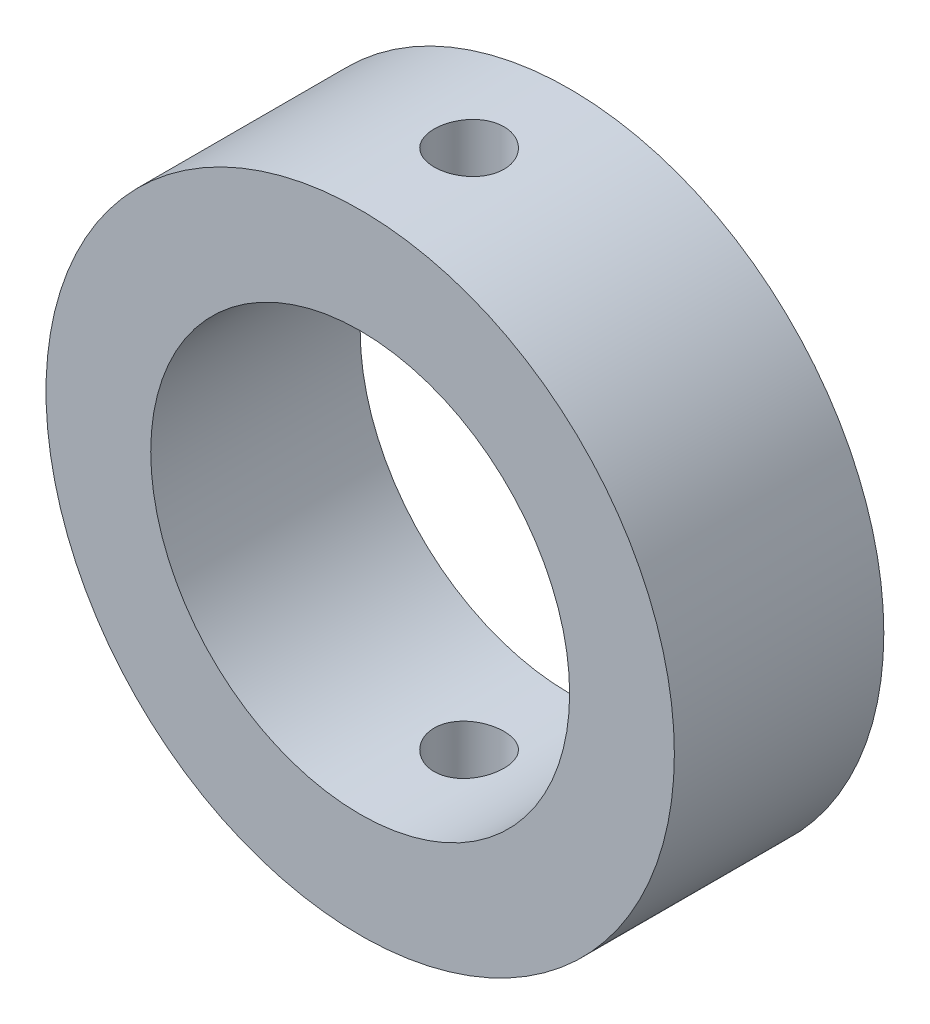
ISO-10303-21;
HEADER;
FILE_DESCRIPTION(('STEP AP214'),'2;1');
FILE_NAME('part.step','',(''),(''),'','','');
FILE_SCHEMA(('AUTOMOTIVE_DESIGN { 1 0 10303 214 1 1 1 1 }'));
ENDSEC;
DATA;
#1=APPLICATION_CONTEXT('core data for automotive mechanical design processes');
#2=APPLICATION_PROTOCOL_DEFINITION('international standard','automotive_design',2000,#1);
#3=PRODUCT_CONTEXT('',#1,'mechanical');
#4=PRODUCT('Part','Part','',(#3));
#5=PRODUCT_RELATED_PRODUCT_CATEGORY('part','',(#4));
#6=PRODUCT_DEFINITION_FORMATION('','',#4);
#7=PRODUCT_DEFINITION_CONTEXT('part definition',#1,'design');
#8=PRODUCT_DEFINITION('design','',#6,#7);
#9=PRODUCT_DEFINITION_SHAPE('','',#8);
#10=(LENGTH_UNIT() NAMED_UNIT(*) SI_UNIT(.MILLI.,.METRE.));
#11=(NAMED_UNIT(*) PLANE_ANGLE_UNIT() SI_UNIT($,.RADIAN.));
#12=(NAMED_UNIT(*) SI_UNIT($,.STERADIAN.) SOLID_ANGLE_UNIT());
#13=UNCERTAINTY_MEASURE_WITH_UNIT(LENGTH_MEASURE(1.E-05),#10,'distance_accuracy_value','');
#14=(GEOMETRIC_REPRESENTATION_CONTEXT(3) GLOBAL_UNCERTAINTY_ASSIGNED_CONTEXT((#13)) GLOBAL_UNIT_ASSIGNED_CONTEXT((#10,
#11,#12)) REPRESENTATION_CONTEXT('',''));
#15=CARTESIAN_POINT('',(0.,0.,0.));
#16=DIRECTION('',(0.,0.,1.));
#17=DIRECTION('',(1.,0.,0.));
#18=AXIS2_PLACEMENT_3D('',#15,#16,#17);
#19=CARTESIAN_POINT('',(0.,0.,15.));
#20=DIRECTION('',(0.,0.,1.));
#21=DIRECTION('',(1.,0.,0.));
#22=AXIS2_PLACEMENT_3D('',#19,#20,#21);
#23=PLANE('',#22);
#24=CARTESIAN_POINT('',(0.,0.,15.));
#25=DIRECTION('',(0.,0.,1.));
#26=DIRECTION('',(1.,0.,0.));
#27=AXIS2_PLACEMENT_3D('',#24,#25,#26);
#28=CIRCLE('',#27,22.5);
#29=CARTESIAN_POINT('',(22.5,0.,15.));
#30=VERTEX_POINT('',#29);
#31=EDGE_CURVE('E10',#30,#30,#28,.T.);
#32=ORIENTED_EDGE('',*,*,#31,.T.);
#33=EDGE_LOOP('',(#32));
#34=FACE_BOUND('',#33,.T.);
#35=CARTESIAN_POINT('',(0.,0.,15.));
#36=DIRECTION('',(0.,0.,1.));
#37=DIRECTION('',(1.,0.,0.));
#38=AXIS2_PLACEMENT_3D('',#35,#36,#37);
#39=CIRCLE('',#38,15.);
#40=CARTESIAN_POINT('',(15.,0.,15.));
#41=VERTEX_POINT('',#40);
#42=EDGE_CURVE('E62',#41,#41,#39,.T.);
#43=ORIENTED_EDGE('',*,*,#42,.F.);
#44=EDGE_LOOP('',(#43));
#45=FACE_BOUND('',#44,.T.);
#46=ADVANCED_FACE('F41',(#34,#45),#23,.T.);
#47=CARTESIAN_POINT('',(0.,0.,0.));
#48=DIRECTION('',(0.,0.,1.));
#49=DIRECTION('',(1.,0.,0.));
#50=AXIS2_PLACEMENT_3D('',#47,#48,#49);
#51=PLANE('',#50);
#52=CARTESIAN_POINT('',(0.,0.,0.));
#53=DIRECTION('',(0.,0.,1.));
#54=DIRECTION('',(1.,0.,0.));
#55=AXIS2_PLACEMENT_3D('',#52,#53,#54);
#56=CIRCLE('',#55,22.5);
#57=CARTESIAN_POINT('',(22.5,0.,0.));
#58=VERTEX_POINT('',#57);
#59=EDGE_CURVE('E56',#58,#58,#56,.T.);
#60=ORIENTED_EDGE('',*,*,#59,.F.);
#61=EDGE_LOOP('',(#60));
#62=FACE_BOUND('',#61,.T.);
#63=CARTESIAN_POINT('',(0.,0.,0.));
#64=DIRECTION('',(0.,0.,1.));
#65=DIRECTION('',(1.,0.,0.));
#66=AXIS2_PLACEMENT_3D('',#63,#64,#65);
#67=CIRCLE('',#66,15.);
#68=CARTESIAN_POINT('',(15.,0.,0.));
#69=VERTEX_POINT('',#68);
#70=EDGE_CURVE('E65',#69,#69,#67,.T.);
#71=ORIENTED_EDGE('',*,*,#70,.T.);
#72=EDGE_LOOP('',(#71));
#73=FACE_BOUND('',#72,.T.);
#74=ADVANCED_FACE('F106',(#62,#73),#51,.F.);
#75=CARTESIAN_POINT('',(0.,0.,15.));
#76=DIRECTION('',(0.,0.,-1.));
#77=DIRECTION('',(-1.,0.,0.));
#78=AXIS2_PLACEMENT_3D('',#75,#76,#77);
#79=CYLINDRICAL_SURFACE('',#78,22.5);
#80=CARTESIAN_POINT('',(0.,-22.5,9.7015139556576));
#81=CARTESIAN_POINT('',(0.139963290436898,-22.4999982319295,9.70150793962353));
#82=CARTESIAN_POINT('',(0.280017003711887,-22.498680176381,9.6897205242765));
#83=CARTESIAN_POINT('',(0.556235592308377,-22.4935489494524,9.64287954512737));
#84=CARTESIAN_POINT('',(0.692396111397232,-22.4897330890894,9.60780090684405));
#85=CARTESIAN_POINT('',(0.956788848837863,-22.4800366342404,9.51541651167991));
#86=CARTESIAN_POINT('',(1.08502602592203,-22.4741573468395,9.45812482333298));
#87=CARTESIAN_POINT('',(1.33003816262482,-22.4609899763586,9.32296943790942));
#88=CARTESIAN_POINT('',(1.44681526466862,-22.4537021573586,9.24510959607115));
#89=CARTESIAN_POINT('',(1.66613219683783,-22.438497147732,9.07066139299739));
#90=CARTESIAN_POINT('',(1.76861447442762,-22.4305776039205,8.97400087458663));
#91=CARTESIAN_POINT('',(1.95593754637563,-22.4150209790671,8.76484961061198));
#92=CARTESIAN_POINT('',(2.04077749124032,-22.4073839116411,8.65235810320943));
#93=CARTESIAN_POINT('',(2.19061627270288,-22.3932333493671,8.41437154536982));
#94=CARTESIAN_POINT('',(2.25556219427924,-22.3867228707193,8.28884298434529));
#95=CARTESIAN_POINT('',(2.36343147250995,-22.3755927254414,8.02857712979876));
#96=CARTESIAN_POINT('',(2.4063554937747,-22.37097300175,7.8938401143226));
#97=CARTESIAN_POINT('',(2.46878993115805,-22.3641693028941,7.61957395832722));
#98=CARTESIAN_POINT('',(2.48839662302771,-22.3619753146837,7.48006698681893));
#99=CARTESIAN_POINT('',(2.50393757504382,-22.3602406332654,7.19972662837));
#100=CARTESIAN_POINT('',(2.49987259455604,-22.3606998549449,7.05889328412288));
#101=CARTESIAN_POINT('',(2.46826480534876,-22.3642105512675,6.78056461194312));
#102=CARTESIAN_POINT('',(2.44082750216216,-22.3672503765387,6.64305713481436));
#103=CARTESIAN_POINT('',(2.36341826447112,-22.3755615896676,6.37461067392166));
#104=CARTESIAN_POINT('',(2.3134459616269,-22.3808330140012,6.24367179756189));
#105=CARTESIAN_POINT('',(2.19227007599314,-22.3930268031299,5.99174842670372));
#106=CARTESIAN_POINT('',(2.1210200860185,-22.3999527698502,5.87078643563783));
#107=CARTESIAN_POINT('',(1.95934463329594,-22.4146723403989,5.64249689224402));
#108=CARTESIAN_POINT('',(1.86891847720993,-22.4224659755942,5.53516983312841));
#109=CARTESIAN_POINT('',(1.67087018617446,-22.4380946122411,5.33658397527184));
#110=CARTESIAN_POINT('',(1.56315700708533,-22.4459296076163,5.24541594912667));
#111=CARTESIAN_POINT('',(1.33390727495122,-22.4607182137728,5.08244097856718));
#112=CARTESIAN_POINT('',(1.2123707003463,-22.4676718231792,5.0106340643504));
#113=CARTESIAN_POINT('',(0.958858294419382,-22.479917262824,4.88842174970165));
#114=CARTESIAN_POINT('',(0.826880006002132,-22.4852087004631,4.83802140443878));
#115=CARTESIAN_POINT('',(0.556262194549203,-22.4935298062661,4.76012173685552));
#116=CARTESIAN_POINT('',(0.417622917822387,-22.4965595579937,4.73262156842469));
#117=CARTESIAN_POINT('',(0.138404164867838,-22.5000051383195,4.70141907851069));
#118=CARTESIAN_POINT('',(-0.00216116111361473,-22.5004347150112,4.69759158841234));
#119=CARTESIAN_POINT('',(-0.28193123585895,-22.4986685150537,4.71351369629893));
#120=CARTESIAN_POINT('',(-0.421136007364149,-22.4964727823619,4.73326289952375));
#121=CARTESIAN_POINT('',(-0.693868824279163,-22.4897113666314,4.79567388122741));
#122=CARTESIAN_POINT('',(-0.827410548202294,-22.4851517930728,4.83827660330445));
#123=CARTESIAN_POINT('',(-1.08545283765862,-22.4741737542704,4.94512430281774));
#124=CARTESIAN_POINT('',(-1.20995315599037,-22.4677552382252,5.00936987172139));
#125=CARTESIAN_POINT('',(-1.44694158139682,-22.4537419625284,5.15798681949632));
#126=CARTESIAN_POINT('',(-1.55937816423878,-22.4461424725451,5.24243990683237));
#127=CARTESIAN_POINT('',(-1.76852479350274,-22.4306339481796,5.42895807857556));
#128=CARTESIAN_POINT('',(-1.86523435019447,-22.4227249041675,5.53102371122303));
#129=CARTESIAN_POINT('',(-2.0406202804102,-22.407446855045,5.75041806699017));
#130=CARTESIAN_POINT('',(-2.11921415672401,-22.4000804205337,5.86781294375545));
#131=CARTESIAN_POINT('',(-2.2555694500626,-22.3867621609139,6.11420931002314));
#132=CARTESIAN_POINT('',(-2.31333120875093,-22.3808103126056,6.24321060912749));
#133=CARTESIAN_POINT('',(-2.40624640126429,-22.3710118528331,6.50888202905337));
#134=CARTESIAN_POINT('',(-2.4414478435141,-22.3671607735444,6.64553518784207));
#135=CARTESIAN_POINT('',(-2.48839847208497,-22.361986494682,6.92285789033464));
#136=CARTESIAN_POINT('',(-2.50014850400818,-22.3606632039622,7.06352728903691));
#137=CARTESIAN_POINT('',(-2.49984946677098,-22.3606965730832,7.34406914948892));
#138=CARTESIAN_POINT('',(-2.48792998803822,-22.3620386401109,7.48394176900879));
#139=CARTESIAN_POINT('',(-2.440903126006,-22.3672202869634,7.75968362856461));
#140=CARTESIAN_POINT('',(-2.40579572545892,-22.3710598686459,7.89555286562268));
#141=CARTESIAN_POINT('',(-2.31342739078205,-22.3807996813889,8.15942334379412));
#142=CARTESIAN_POINT('',(-2.25617129922743,-22.3866994619816,8.28742629770188));
#143=CARTESIAN_POINT('',(-2.12114385984066,-22.3998957650258,8.53202707246773));
#144=CARTESIAN_POINT('',(-2.04337247029699,-22.4071922903172,8.6486248701363));
#145=CARTESIAN_POINT('',(-1.86903744067134,-22.4224078492528,8.86776926331564));
#146=CARTESIAN_POINT('',(-1.77237713625398,-22.4303299544675,8.97023875000251));
#147=CARTESIAN_POINT('',(-1.56320524060516,-22.4458763267716,9.1575562959211));
#148=CARTESIAN_POINT('',(-1.45068988450814,-22.45350052257,9.24240015798156));
#149=CARTESIAN_POINT('',(-1.21261810846859,-22.4676169012086,9.39226936859527));
#150=CARTESIAN_POINT('',(-1.08702305802012,-22.4741055698385,9.45723364282128));
#151=CARTESIAN_POINT('',(-0.82671061895154,-22.4851829429196,9.56506082121364));
#152=CARTESIAN_POINT('',(-0.692003549930552,-22.4897737561695,9.60794826907533));
#153=CARTESIAN_POINT('',(-0.463800299140749,-22.4954040690738,9.65988790748981));
#154=CARTESIAN_POINT('',(-0.371755168576704,-22.4971193575046,9.67547589120662));
#155=CARTESIAN_POINT('',(-0.186486737378385,-22.499417908987,9.69629089173759));
#156=CARTESIAN_POINT('',(-0.0932634430968842,-22.50000117814,9.70151796439482));
#157=CARTESIAN_POINT('',(0.,-22.5,9.7015139556576));
#158=B_SPLINE_CURVE_WITH_KNOTS('',3,(#80,#81,#82,#83,#84,#85,#86,#87,#88,#89,#90,#91,#92,#93,
#94,#95,#96,#97,#98,#99,#100,#101,#102,#103,#104,#105,#106,#107,#108,#109,#110,#111,#112,#113,
#114,#115,#116,#117,#118,#119,#120,#121,#122,#123,#124,#125,#126,#127,#128,#129,#130,#131,#132,
#133,#134,#135,#136,#137,#138,#139,#140,#141,#142,#143,#144,#145,#146,#147,#148,#149,#150,#151,
#152,#153,#154,#155,#156,#157),.UNSPECIFIED.,.T.,.F.,(4,2,2,2,2,2,2,2,2,2,2,2,2,2,2,2,2,2,2,2,2,
2,2,2,2,2,2,2,2,2,2,2,2,2,2,2,2,2,4),(0.,0.419549267838508,0.839550941048734,1.25928704150093,
1.67894452352149,2.10024562230456,2.5215670024037,2.94399949132785,3.36641923069172,
3.78708870275308,4.2077446801939,4.62651176678918,5.0452856984773,5.46497974166264,
5.88468896199524,6.30668590666613,6.728683509522,7.1507807119326,7.57286231810132,
7.99271025838008,8.41255116896649,8.83131234699257,9.25008497007836,9.67058038609554,
10.0910888935848,10.5134761069732,10.9358563925552,11.3573348406517,11.7787980909618,
12.1979601942483,12.6171226093159,13.0361934307407,13.4552651042228,13.8765403683299,
14.2979158355662,14.7205731535823,15.1427595660994,15.4223244437306,15.7018878145635),.UNSPECIFIED.);
#159=CARTESIAN_POINT('',(0.,-22.5,9.7015139556576));
#160=VERTEX_POINT('',#159);
#161=EDGE_CURVE('E92',#160,#160,#158,.T.);
#162=ORIENTED_EDGE('',*,*,#161,.T.);
#163=EDGE_LOOP('',(#162));
#164=FACE_BOUND('',#163,.T.);
#165=CARTESIAN_POINT('',(0.,22.5,9.7015139556576));
#166=CARTESIAN_POINT('',(-0.139963290436898,22.4999982319295,9.70150793962353));
#167=CARTESIAN_POINT('',(-0.280017003711887,22.498680176381,9.6897205242765));
#168=CARTESIAN_POINT('',(-0.556235592308377,22.4935489494524,9.64287954512737));
#169=CARTESIAN_POINT('',(-0.692396111397232,22.4897330890894,9.60780090684405));
#170=CARTESIAN_POINT('',(-0.956788848837863,22.4800366342404,9.51541651167991));
#171=CARTESIAN_POINT('',(-1.08502602592203,22.4741573468395,9.45812482333298));
#172=CARTESIAN_POINT('',(-1.33003816262482,22.4609899763586,9.32296943790942));
#173=CARTESIAN_POINT('',(-1.44681526466862,22.4537021573586,9.24510959607115));
#174=CARTESIAN_POINT('',(-1.66613219683783,22.438497147732,9.07066139299739));
#175=CARTESIAN_POINT('',(-1.76861447442762,22.4305776039205,8.97400087458663));
#176=CARTESIAN_POINT('',(-1.95593754637563,22.4150209790671,8.76484961061198));
#177=CARTESIAN_POINT('',(-2.04077749124032,22.4073839116411,8.65235810320943));
#178=CARTESIAN_POINT('',(-2.19061627270288,22.3932333493671,8.41437154536982));
#179=CARTESIAN_POINT('',(-2.25556219427924,22.3867228707193,8.28884298434529));
#180=CARTESIAN_POINT('',(-2.36343147250995,22.3755927254414,8.02857712979876));
#181=CARTESIAN_POINT('',(-2.4063554937747,22.37097300175,7.8938401143226));
#182=CARTESIAN_POINT('',(-2.46878993115805,22.3641693028941,7.61957395832722));
#183=CARTESIAN_POINT('',(-2.48839662302771,22.3619753146837,7.48006698681893));
#184=CARTESIAN_POINT('',(-2.50393757504382,22.3602406332654,7.19972662837));
#185=CARTESIAN_POINT('',(-2.49987259455604,22.3606998549449,7.05889328412288));
#186=CARTESIAN_POINT('',(-2.46826480534876,22.3642105512675,6.78056461194312));
#187=CARTESIAN_POINT('',(-2.44082750216216,22.3672503765387,6.64305713481436));
#188=CARTESIAN_POINT('',(-2.36341826447112,22.3755615896676,6.37461067392166));
#189=CARTESIAN_POINT('',(-2.3134459616269,22.3808330140012,6.24367179756189));
#190=CARTESIAN_POINT('',(-2.19227007599314,22.3930268031299,5.99174842670372));
#191=CARTESIAN_POINT('',(-2.1210200860185,22.3999527698502,5.87078643563783));
#192=CARTESIAN_POINT('',(-1.95934463329594,22.4146723403989,5.64249689224402));
#193=CARTESIAN_POINT('',(-1.86891847720993,22.4224659755942,5.53516983312841));
#194=CARTESIAN_POINT('',(-1.67087018617446,22.4380946122411,5.33658397527184));
#195=CARTESIAN_POINT('',(-1.56315700708533,22.4459296076163,5.24541594912667));
#196=CARTESIAN_POINT('',(-1.33390727495122,22.4607182137728,5.08244097856718));
#197=CARTESIAN_POINT('',(-1.2123707003463,22.4676718231792,5.0106340643504));
#198=CARTESIAN_POINT('',(-0.958858294419382,22.479917262824,4.88842174970165));
#199=CARTESIAN_POINT('',(-0.826880006002132,22.4852087004631,4.83802140443878));
#200=CARTESIAN_POINT('',(-0.556262194549203,22.4935298062661,4.76012173685552));
#201=CARTESIAN_POINT('',(-0.417622917822387,22.4965595579937,4.73262156842469));
#202=CARTESIAN_POINT('',(-0.138404164867838,22.5000051383195,4.70141907851069));
#203=CARTESIAN_POINT('',(0.00216116111361473,22.5004347150112,4.69759158841234));
#204=CARTESIAN_POINT('',(0.28193123585895,22.4986685150537,4.71351369629893));
#205=CARTESIAN_POINT('',(0.421136007364149,22.4964727823619,4.73326289952375));
#206=CARTESIAN_POINT('',(0.693868824279163,22.4897113666314,4.79567388122741));
#207=CARTESIAN_POINT('',(0.827410548202294,22.4851517930728,4.83827660330445));
#208=CARTESIAN_POINT('',(1.08545283765862,22.4741737542704,4.94512430281774));
#209=CARTESIAN_POINT('',(1.20995315599037,22.4677552382252,5.00936987172139));
#210=CARTESIAN_POINT('',(1.44694158139682,22.4537419625284,5.15798681949632));
#211=CARTESIAN_POINT('',(1.55937816423878,22.4461424725451,5.24243990683237));
#212=CARTESIAN_POINT('',(1.76852479350274,22.4306339481796,5.42895807857556));
#213=CARTESIAN_POINT('',(1.86523435019447,22.4227249041675,5.53102371122303));
#214=CARTESIAN_POINT('',(2.0406202804102,22.407446855045,5.75041806699017));
#215=CARTESIAN_POINT('',(2.11921415672401,22.4000804205337,5.86781294375545));
#216=CARTESIAN_POINT('',(2.2555694500626,22.3867621609139,6.11420931002314));
#217=CARTESIAN_POINT('',(2.31333120875093,22.3808103126056,6.24321060912749));
#218=CARTESIAN_POINT('',(2.40624640126429,22.3710118528331,6.50888202905337));
#219=CARTESIAN_POINT('',(2.4414478435141,22.3671607735444,6.64553518784207));
#220=CARTESIAN_POINT('',(2.48839847208497,22.361986494682,6.92285789033464));
#221=CARTESIAN_POINT('',(2.50014850400818,22.3606632039622,7.06352728903691));
#222=CARTESIAN_POINT('',(2.49984946677098,22.3606965730832,7.34406914948892));
#223=CARTESIAN_POINT('',(2.48792998803822,22.3620386401109,7.48394176900879));
#224=CARTESIAN_POINT('',(2.440903126006,22.3672202869634,7.75968362856461));
#225=CARTESIAN_POINT('',(2.40579572545892,22.3710598686459,7.89555286562268));
#226=CARTESIAN_POINT('',(2.31342739078205,22.3807996813889,8.15942334379412));
#227=CARTESIAN_POINT('',(2.25617129922743,22.3866994619816,8.28742629770188));
#228=CARTESIAN_POINT('',(2.12114385984066,22.3998957650258,8.53202707246773));
#229=CARTESIAN_POINT('',(2.04337247029699,22.4071922903172,8.6486248701363));
#230=CARTESIAN_POINT('',(1.86903744067134,22.4224078492528,8.86776926331564));
#231=CARTESIAN_POINT('',(1.77237713625398,22.4303299544675,8.97023875000251));
#232=CARTESIAN_POINT('',(1.56320524060516,22.4458763267716,9.1575562959211));
#233=CARTESIAN_POINT('',(1.45068988450814,22.45350052257,9.24240015798156));
#234=CARTESIAN_POINT('',(1.21261810846859,22.4676169012086,9.39226936859527));
#235=CARTESIAN_POINT('',(1.08702305802012,22.4741055698385,9.45723364282128));
#236=CARTESIAN_POINT('',(0.82671061895154,22.4851829429196,9.56506082121364));
#237=CARTESIAN_POINT('',(0.692003549930552,22.4897737561695,9.60794826907533));
#238=CARTESIAN_POINT('',(0.463800299140749,22.4954040690738,9.65988790748981));
#239=CARTESIAN_POINT('',(0.371755168576704,22.4971193575046,9.67547589120662));
#240=CARTESIAN_POINT('',(0.186486737378385,22.499417908987,9.69629089173759));
#241=CARTESIAN_POINT('',(0.0932634430968842,22.50000117814,9.70151796439482));
#242=CARTESIAN_POINT('',(0.,22.5,9.7015139556576));
#243=B_SPLINE_CURVE_WITH_KNOTS('',3,(#165,#166,#167,#168,#169,#170,#171,#172,#173,#174,#175,
#176,#177,#178,#179,#180,#181,#182,#183,#184,#185,#186,#187,#188,#189,#190,#191,#192,#193,#194,
#195,#196,#197,#198,#199,#200,#201,#202,#203,#204,#205,#206,#207,#208,#209,#210,#211,#212,#213,
#214,#215,#216,#217,#218,#219,#220,#221,#222,#223,#224,#225,#226,#227,#228,#229,#230,#231,#232,
#233,#234,#235,#236,#237,#238,#239,#240,#241,#242),.UNSPECIFIED.,.T.,.F.,(4,2,2,2,2,2,2,2,2,2,2,
2,2,2,2,2,2,2,2,2,2,2,2,2,2,2,2,2,2,2,2,2,2,2,2,2,2,2,4),(0.,0.419549267838508,
0.839550941048734,1.25928704150093,1.67894452352149,2.10024562230456,2.5215670024037,
2.94399949132785,3.36641923069172,3.78708870275308,4.2077446801939,4.62651176678918,
5.0452856984773,5.46497974166264,5.88468896199524,6.30668590666613,6.728683509522,
7.1507807119326,7.57286231810132,7.99271025838008,8.41255116896649,8.83131234699257,
9.25008497007836,9.67058038609554,10.0910888935848,10.5134761069732,10.9358563925552,
11.3573348406517,11.7787980909618,12.1979601942483,12.6171226093159,13.0361934307407,
13.4552651042228,13.8765403683299,14.2979158355662,14.7205731535823,15.1427595660994,
15.4223244437306,15.7018878145635),.UNSPECIFIED.);
#244=CARTESIAN_POINT('',(0.,22.5,9.7015139556576));
#245=VERTEX_POINT('',#244);
#246=EDGE_CURVE('E86',#245,#245,#243,.T.);
#247=ORIENTED_EDGE('',*,*,#246,.T.);
#248=EDGE_LOOP('',(#247));
#249=FACE_BOUND('',#248,.T.);
#250=ORIENTED_EDGE('',*,*,#31,.F.);
#251=EDGE_LOOP('',(#250));
#252=FACE_BOUND('',#251,.T.);
#253=ORIENTED_EDGE('',*,*,#59,.T.);
#254=EDGE_LOOP('',(#253));
#255=FACE_BOUND('',#254,.T.);
#256=ADVANCED_FACE('F43',(#164,#249,#252,#255),#79,.T.);
#257=CARTESIAN_POINT('',(0.,0.,15.));
#258=DIRECTION('',(0.,0.,-1.));
#259=DIRECTION('',(-1.,0.,0.));
#260=AXIS2_PLACEMENT_3D('',#257,#258,#259);
#261=CYLINDRICAL_SURFACE('',#260,15.);
#262=CARTESIAN_POINT('',(0.,-15.,9.7015139556576));
#263=CARTESIAN_POINT('',(0.139390904958215,-14.9999976116882,9.70150836670978));
#264=CARTESIAN_POINT('',(0.278857881838821,-14.9980367791303,9.68981668068868));
#265=CARTESIAN_POINT('',(0.553880221673043,-14.9904034494139,9.64337829689228));
#266=CARTESIAN_POINT('',(0.689431867959247,-14.9847275392389,9.608610398746));
#267=CARTESIAN_POINT('',(0.952604747212645,-14.9703006823645,9.51709850706485));
#268=CARTESIAN_POINT('',(1.0802323684319,-14.9615522515919,9.46037249001703));
#269=CARTESIAN_POINT('',(1.32414184197795,-14.9419422708207,9.32660166360521));
#270=CARTESIAN_POINT('',(1.44042498987859,-14.9310809625443,9.2495591781746));
#271=CARTESIAN_POINT('',(1.65947261429168,-14.9083331745831,9.07655887183714));
#272=CARTESIAN_POINT('',(1.76211290353497,-14.8964387181486,8.98044484102147));
#273=CARTESIAN_POINT('',(1.94988849865993,-14.8730262687673,8.77236598718479));
#274=CARTESIAN_POINT('',(2.03502269939097,-14.8615082996267,8.66040016420099));
#275=CARTESIAN_POINT('',(2.18586712560513,-14.8400756575978,8.42294298946055));
#276=CARTESIAN_POINT('',(2.251454552861,-14.8301712909164,8.29737261885285));
#277=CARTESIAN_POINT('',(2.36055836541122,-14.8131978979467,8.03680439135697));
#278=CARTESIAN_POINT('',(2.40407624156561,-14.8061286801431,7.90180717197997));
#279=CARTESIAN_POINT('',(2.46741437778481,-14.7957053684276,7.62753368080106));
#280=CARTESIAN_POINT('',(2.4874490291354,-14.792317684857,7.48830821915621));
#281=CARTESIAN_POINT('',(2.50391672528988,-14.7895393893665,7.20843367877413));
#282=CARTESIAN_POINT('',(2.500351440389,-14.7901484945721,7.0677847014903));
#283=CARTESIAN_POINT('',(2.46989509839615,-14.7952642886356,6.79058609438215));
#284=CARTESIAN_POINT('',(2.44324488188977,-14.7997307331892,6.65400915211237));
#285=CARTESIAN_POINT('',(2.36775314040345,-14.8119949521101,6.38729263782847));
#286=CARTESIAN_POINT('',(2.31891085431974,-14.8197928407327,6.25715328676906));
#287=CARTESIAN_POINT('',(2.20017724609391,-14.837884793341,6.00628513221668));
#288=CARTESIAN_POINT('',(2.13018591387971,-14.8481906710733,5.88560454957637));
#289=CARTESIAN_POINT('',(1.97121201755743,-14.8701291841501,5.65760955511922));
#290=CARTESIAN_POINT('',(1.88222792065429,-14.8817619265429,5.55029622320267));
#291=CARTESIAN_POINT('',(1.68648221215905,-14.9052202787979,5.35068786985025));
#292=CARTESIAN_POINT('',(1.57951396387313,-14.9170464923165,5.25859543711752));
#293=CARTESIAN_POINT('',(1.35153524898165,-14.9394260139672,5.09363619299226));
#294=CARTESIAN_POINT('',(1.23052469190642,-14.9499793138975,5.02076950547437));
#295=CARTESIAN_POINT('',(0.977705916166711,-14.9686389289291,4.89631172852132));
#296=CARTESIAN_POINT('',(0.845888725564661,-14.9767431840745,4.84473853632634));
#297=CARTESIAN_POINT('',(0.575298345602731,-14.9895750301266,4.76451974041162));
#298=CARTESIAN_POINT('',(0.436525739179468,-14.9943029035047,4.73587221868388));
#299=CARTESIAN_POINT('',(0.157709901301624,-14.9998112984269,4.70259259719647));
#300=CARTESIAN_POINT('',(0.0177007371510115,-15.0006375301278,4.69768238385199));
#301=CARTESIAN_POINT('',(-0.261139772889887,-14.9983747442117,4.71127530008572));
#302=CARTESIAN_POINT('',(-0.399971163892039,-14.9952858772412,4.72977752879134));
#303=CARTESIAN_POINT('',(-0.671656175546763,-14.985568269382,4.78943880499308));
#304=CARTESIAN_POINT('',(-0.804540868385379,-14.9789610480131,4.83046016404773));
#305=CARTESIAN_POINT('',(-1.06154688486044,-14.9629446445536,4.93384847385714));
#306=CARTESIAN_POINT('',(-1.18566771590972,-14.9535353051202,4.99621662329287));
#307=CARTESIAN_POINT('',(-1.42283068946896,-14.9328451630241,5.14116508035439));
#308=CARTESIAN_POINT('',(-1.53576525093715,-14.9215485588702,5.22391911182485));
#309=CARTESIAN_POINT('',(-1.74624358550269,-14.898384673919,5.40705127104266));
#310=CARTESIAN_POINT('',(-1.84378623969658,-14.8865173517155,5.50743067893427));
#311=CARTESIAN_POINT('',(-2.021742779658,-14.8634017523585,5.72421150372902));
#312=CARTESIAN_POINT('',(-2.10196876111372,-14.8521611613711,5.84076812117201));
#313=CARTESIAN_POINT('',(-2.24170231029499,-14.8317152977788,6.08586692479614));
#314=CARTESIAN_POINT('',(-2.30121053476982,-14.8225099606602,6.2144087308851));
#315=CARTESIAN_POINT('',(-2.39753833147315,-14.807234536977,6.47930368846973));
#316=CARTESIAN_POINT('',(-2.43445143254795,-14.8011515431106,6.61562205068809));
#317=CARTESIAN_POINT('',(-2.48483545377828,-14.7927771683526,6.89263408487936));
#318=CARTESIAN_POINT('',(-2.49830841194617,-14.7904854578272,7.03332737538965));
#319=CARTESIAN_POINT('',(-2.50137286604735,-14.7899673308401,7.31321912162001));
#320=CARTESIAN_POINT('',(-2.49126013612519,-14.7916905650565,7.45241433423289));
#321=CARTESIAN_POINT('',(-2.44807983895685,-14.7988978145373,7.72709320370837));
#322=CARTESIAN_POINT('',(-2.41501234611248,-14.8043818176121,7.86257687259947));
#323=CARTESIAN_POINT('',(-2.3269744895949,-14.8184735628172,8.12587239295022));
#324=CARTESIAN_POINT('',(-2.27202959060044,-14.8270776721967,8.25369296571363));
#325=CARTESIAN_POINT('',(-2.14182700391591,-14.8464436892221,8.49834962485245));
#326=CARTESIAN_POINT('',(-2.06656830874856,-14.857205703884,8.61518516602974));
#327=CARTESIAN_POINT('',(-1.89681888437216,-14.8798345404562,8.83604953876536));
#328=CARTESIAN_POINT('',(-1.80211056359365,-14.891712955763,8.93990997235787));
#329=CARTESIAN_POINT('',(-1.59660903138023,-14.9151437236084,9.13036556013254));
#330=CARTESIAN_POINT('',(-1.48581211291264,-14.9266960002655,9.21695672429577));
#331=CARTESIAN_POINT('',(-1.25036916964028,-14.9482652964222,9.37096222385755));
#332=CARTESIAN_POINT('',(-1.12563278753282,-14.958271162531,9.43823999497055));
#333=CARTESIAN_POINT('',(-0.866513069378983,-14.9755116760178,9.55078344026752));
#334=CARTESIAN_POINT('',(-0.732139494830011,-14.9827490817748,9.5960710367373));
#335=CARTESIAN_POINT('',(-0.497703310045402,-14.9920579083296,9.65351922978427));
#336=CARTESIAN_POINT('',(-0.399058830298448,-14.9950202727336,9.67148842527357));
#337=CARTESIAN_POINT('',(-0.200289310319809,-14.9989921598612,9.69548769350235));
#338=CARTESIAN_POINT('',(-0.100164295608494,-15.0000017162064,9.70151797179496));
#339=CARTESIAN_POINT('',(0.,-15.,9.7015139556576));
#340=B_SPLINE_CURVE_WITH_KNOTS('',3,(#262,#263,#264,#265,#266,#267,#268,#269,#270,#271,#272,
#273,#274,#275,#276,#277,#278,#279,#280,#281,#282,#283,#284,#285,#286,#287,#288,#289,#290,#291,
#292,#293,#294,#295,#296,#297,#298,#299,#300,#301,#302,#303,#304,#305,#306,#307,#308,#309,#310,
#311,#312,#313,#314,#315,#316,#317,#318,#319,#320,#321,#322,#323,#324,#325,#326,#327,#328,#329,
#330,#331,#332,#333,#334,#335,#336,#337,#338,#339),.UNSPECIFIED.,.T.,.F.,(4,2,2,2,2,2,2,2,2,2,2,
2,2,2,2,2,2,2,2,2,2,2,2,2,2,2,2,2,2,2,2,2,2,2,2,2,2,2,4),(0.,0.41780658493851,0.835997545695421,
1.25384686702527,1.67164841267479,2.09302491062332,2.51442800169857,2.9384252082384,
3.36239376876181,3.78246077103424,4.20249804320886,4.61820521760409,5.03392665025381,
5.45164556632558,5.86939820680574,6.29232769911327,6.71525991635848,7.13854688915903,
7.56179844521149,7.98007883491397,8.3983431303586,8.81407807006415,9.22983635826066,
9.64926825627024,10.0687306305428,10.4925382200762,10.9163323737594,11.3383602234177,
11.7603513778662,12.177079095227,12.5938054618813,13.0100481822622,13.4263115502934,
13.8475138419339,14.2688133387897,14.693022316072,15.1168075213007,15.4170424816402,
15.7172722727697),.UNSPECIFIED.);
#341=CARTESIAN_POINT('',(0.,-15.,9.7015139556576));
#342=VERTEX_POINT('',#341);
#343=EDGE_CURVE('E46',#342,#342,#340,.T.);
#344=ORIENTED_EDGE('',*,*,#343,.F.);
#345=EDGE_LOOP('',(#344));
#346=FACE_BOUND('',#345,.T.);
#347=CARTESIAN_POINT('',(0.,15.,9.7015139556576));
#348=CARTESIAN_POINT('',(-0.139390904958215,14.9999976116882,9.70150836670978));
#349=CARTESIAN_POINT('',(-0.278857881838821,14.9980367791303,9.68981668068868));
#350=CARTESIAN_POINT('',(-0.553880221673043,14.9904034494139,9.64337829689228));
#351=CARTESIAN_POINT('',(-0.689431867959247,14.9847275392389,9.608610398746));
#352=CARTESIAN_POINT('',(-0.952604747212645,14.9703006823645,9.51709850706485));
#353=CARTESIAN_POINT('',(-1.0802323684319,14.9615522515919,9.46037249001703));
#354=CARTESIAN_POINT('',(-1.32414184197795,14.9419422708207,9.32660166360521));
#355=CARTESIAN_POINT('',(-1.44042498987859,14.9310809625443,9.2495591781746));
#356=CARTESIAN_POINT('',(-1.65947261429168,14.9083331745831,9.07655887183714));
#357=CARTESIAN_POINT('',(-1.76211290353497,14.8964387181486,8.98044484102147));
#358=CARTESIAN_POINT('',(-1.94988849865993,14.8730262687673,8.77236598718479));
#359=CARTESIAN_POINT('',(-2.03502269939097,14.8615082996267,8.66040016420099));
#360=CARTESIAN_POINT('',(-2.18586712560513,14.8400756575978,8.42294298946055));
#361=CARTESIAN_POINT('',(-2.251454552861,14.8301712909164,8.29737261885285));
#362=CARTESIAN_POINT('',(-2.36055836541122,14.8131978979467,8.03680439135697));
#363=CARTESIAN_POINT('',(-2.40407624156561,14.8061286801431,7.90180717197997));
#364=CARTESIAN_POINT('',(-2.46741437778481,14.7957053684276,7.62753368080106));
#365=CARTESIAN_POINT('',(-2.4874490291354,14.792317684857,7.48830821915621));
#366=CARTESIAN_POINT('',(-2.50391672528988,14.7895393893665,7.20843367877413));
#367=CARTESIAN_POINT('',(-2.500351440389,14.7901484945721,7.0677847014903));
#368=CARTESIAN_POINT('',(-2.46989509839615,14.7952642886356,6.79058609438215));
#369=CARTESIAN_POINT('',(-2.44324488188977,14.7997307331892,6.65400915211237));
#370=CARTESIAN_POINT('',(-2.36775314040345,14.8119949521101,6.38729263782847));
#371=CARTESIAN_POINT('',(-2.31891085431974,14.8197928407327,6.25715328676906));
#372=CARTESIAN_POINT('',(-2.20017724609391,14.837884793341,6.00628513221668));
#373=CARTESIAN_POINT('',(-2.13018591387971,14.8481906710733,5.88560454957637));
#374=CARTESIAN_POINT('',(-1.97121201755743,14.8701291841501,5.65760955511922));
#375=CARTESIAN_POINT('',(-1.88222792065429,14.8817619265429,5.55029622320267));
#376=CARTESIAN_POINT('',(-1.68648221215905,14.9052202787979,5.35068786985025));
#377=CARTESIAN_POINT('',(-1.57951396387313,14.9170464923165,5.25859543711752));
#378=CARTESIAN_POINT('',(-1.35153524898165,14.9394260139672,5.09363619299226));
#379=CARTESIAN_POINT('',(-1.23052469190642,14.9499793138975,5.02076950547437));
#380=CARTESIAN_POINT('',(-0.977705916166711,14.9686389289291,4.89631172852132));
#381=CARTESIAN_POINT('',(-0.845888725564661,14.9767431840745,4.84473853632634));
#382=CARTESIAN_POINT('',(-0.575298345602731,14.9895750301266,4.76451974041162));
#383=CARTESIAN_POINT('',(-0.436525739179468,14.9943029035047,4.73587221868388));
#384=CARTESIAN_POINT('',(-0.157709901301624,14.9998112984269,4.70259259719647));
#385=CARTESIAN_POINT('',(-0.0177007371510115,15.0006375301278,4.69768238385199));
#386=CARTESIAN_POINT('',(0.261139772889887,14.9983747442117,4.71127530008572));
#387=CARTESIAN_POINT('',(0.399971163892039,14.9952858772412,4.72977752879134));
#388=CARTESIAN_POINT('',(0.671656175546763,14.985568269382,4.78943880499308));
#389=CARTESIAN_POINT('',(0.804540868385379,14.9789610480131,4.83046016404773));
#390=CARTESIAN_POINT('',(1.06154688486044,14.9629446445536,4.93384847385714));
#391=CARTESIAN_POINT('',(1.18566771590972,14.9535353051202,4.99621662329287));
#392=CARTESIAN_POINT('',(1.42283068946896,14.9328451630241,5.14116508035439));
#393=CARTESIAN_POINT('',(1.53576525093715,14.9215485588702,5.22391911182485));
#394=CARTESIAN_POINT('',(1.74624358550269,14.898384673919,5.40705127104266));
#395=CARTESIAN_POINT('',(1.84378623969658,14.8865173517155,5.50743067893427));
#396=CARTESIAN_POINT('',(2.021742779658,14.8634017523585,5.72421150372902));
#397=CARTESIAN_POINT('',(2.10196876111372,14.8521611613711,5.84076812117201));
#398=CARTESIAN_POINT('',(2.24170231029499,14.8317152977788,6.08586692479614));
#399=CARTESIAN_POINT('',(2.30121053476982,14.8225099606602,6.2144087308851));
#400=CARTESIAN_POINT('',(2.39753833147315,14.807234536977,6.47930368846973));
#401=CARTESIAN_POINT('',(2.43445143254795,14.8011515431106,6.61562205068809));
#402=CARTESIAN_POINT('',(2.48483545377828,14.7927771683526,6.89263408487936));
#403=CARTESIAN_POINT('',(2.49830841194617,14.7904854578272,7.03332737538965));
#404=CARTESIAN_POINT('',(2.50137286604735,14.7899673308401,7.31321912162001));
#405=CARTESIAN_POINT('',(2.49126013612519,14.7916905650565,7.45241433423289));
#406=CARTESIAN_POINT('',(2.44807983895685,14.7988978145373,7.72709320370837));
#407=CARTESIAN_POINT('',(2.41501234611248,14.8043818176121,7.86257687259947));
#408=CARTESIAN_POINT('',(2.3269744895949,14.8184735628172,8.12587239295022));
#409=CARTESIAN_POINT('',(2.27202959060044,14.8270776721967,8.25369296571363));
#410=CARTESIAN_POINT('',(2.14182700391591,14.8464436892221,8.49834962485245));
#411=CARTESIAN_POINT('',(2.06656830874856,14.857205703884,8.61518516602974));
#412=CARTESIAN_POINT('',(1.89681888437216,14.8798345404562,8.83604953876536));
#413=CARTESIAN_POINT('',(1.80211056359365,14.891712955763,8.93990997235787));
#414=CARTESIAN_POINT('',(1.59660903138023,14.9151437236084,9.13036556013254));
#415=CARTESIAN_POINT('',(1.48581211291264,14.9266960002655,9.21695672429577));
#416=CARTESIAN_POINT('',(1.25036916964028,14.9482652964222,9.37096222385755));
#417=CARTESIAN_POINT('',(1.12563278753282,14.958271162531,9.43823999497055));
#418=CARTESIAN_POINT('',(0.866513069378983,14.9755116760178,9.55078344026752));
#419=CARTESIAN_POINT('',(0.732139494830011,14.9827490817748,9.5960710367373));
#420=CARTESIAN_POINT('',(0.497703310045402,14.9920579083296,9.65351922978427));
#421=CARTESIAN_POINT('',(0.399058830298448,14.9950202727336,9.67148842527357));
#422=CARTESIAN_POINT('',(0.200289310319809,14.9989921598612,9.69548769350235));
#423=CARTESIAN_POINT('',(0.100164295608494,15.0000017162064,9.70151797179496));
#424=CARTESIAN_POINT('',(0.,15.,9.7015139556576));
#425=B_SPLINE_CURVE_WITH_KNOTS('',3,(#347,#348,#349,#350,#351,#352,#353,#354,#355,#356,#357,
#358,#359,#360,#361,#362,#363,#364,#365,#366,#367,#368,#369,#370,#371,#372,#373,#374,#375,#376,
#377,#378,#379,#380,#381,#382,#383,#384,#385,#386,#387,#388,#389,#390,#391,#392,#393,#394,#395,
#396,#397,#398,#399,#400,#401,#402,#403,#404,#405,#406,#407,#408,#409,#410,#411,#412,#413,#414,
#415,#416,#417,#418,#419,#420,#421,#422,#423,#424),.UNSPECIFIED.,.T.,.F.,(4,2,2,2,2,2,2,2,2,2,2,
2,2,2,2,2,2,2,2,2,2,2,2,2,2,2,2,2,2,2,2,2,2,2,2,2,2,2,4),(0.,0.41780658493851,0.835997545695421,
1.25384686702527,1.67164841267479,2.09302491062332,2.51442800169857,2.9384252082384,
3.36239376876181,3.78246077103424,4.20249804320886,4.61820521760409,5.03392665025381,
5.45164556632558,5.86939820680574,6.29232769911327,6.71525991635848,7.13854688915903,
7.56179844521149,7.98007883491397,8.3983431303586,8.81407807006415,9.22983635826066,
9.64926825627024,10.0687306305428,10.4925382200762,10.9163323737594,11.3383602234177,
11.7603513778662,12.177079095227,12.5938054618813,13.0100481822622,13.4263115502934,
13.8475138419339,14.2688133387897,14.693022316072,15.1168075213007,15.4170424816402,
15.7172722727697),.UNSPECIFIED.);
#426=CARTESIAN_POINT('',(0.,15.,9.7015139556576));
#427=VERTEX_POINT('',#426);
#428=EDGE_CURVE('E67',#427,#427,#425,.T.);
#429=ORIENTED_EDGE('',*,*,#428,.F.);
#430=EDGE_LOOP('',(#429));
#431=FACE_BOUND('',#430,.T.);
#432=ORIENTED_EDGE('',*,*,#42,.T.);
#433=EDGE_LOOP('',(#432));
#434=FACE_BOUND('',#433,.T.);
#435=ORIENTED_EDGE('',*,*,#70,.F.);
#436=EDGE_LOOP('',(#435));
#437=FACE_BOUND('',#436,.T.);
#438=ADVANCED_FACE('F73',(#346,#431,#434,#437),#261,.F.);
#439=CARTESIAN_POINT('',(0.,-50.,7.2015139556576));
#440=DIRECTION('',(0.,1.,0.));
#441=DIRECTION('',(0.,0.,1.));
#442=AXIS2_PLACEMENT_3D('',#439,#440,#441);
#443=CYLINDRICAL_SURFACE('',#442,2.5);
#444=ORIENTED_EDGE('',*,*,#428,.T.);
#445=EDGE_LOOP('',(#444));
#446=FACE_BOUND('',#445,.T.);
#447=ORIENTED_EDGE('',*,*,#246,.F.);
#448=EDGE_LOOP('',(#447));
#449=FACE_BOUND('',#448,.T.);
#450=ADVANCED_FACE('F79',(#446,#449),#443,.F.);
#451=ORIENTED_EDGE('',*,*,#343,.T.);
#452=EDGE_LOOP('',(#451));
#453=FACE_BOUND('',#452,.T.);
#454=ORIENTED_EDGE('',*,*,#161,.F.);
#455=EDGE_LOOP('',(#454));
#456=FACE_BOUND('',#455,.T.);
#457=ADVANCED_FACE('F76',(#453,#456),#443,.F.);
#458=CLOSED_SHELL('',(#46,#74,#256,#438,#450,#457));
#459=MANIFOLD_SOLID_BREP('B2',#458);
#460=ADVANCED_BREP_SHAPE_REPRESENTATION('',(#18,#459),#14);
#461=SHAPE_DEFINITION_REPRESENTATION(#9,#460);
ENDSEC;
END-ISO-10303-21;
